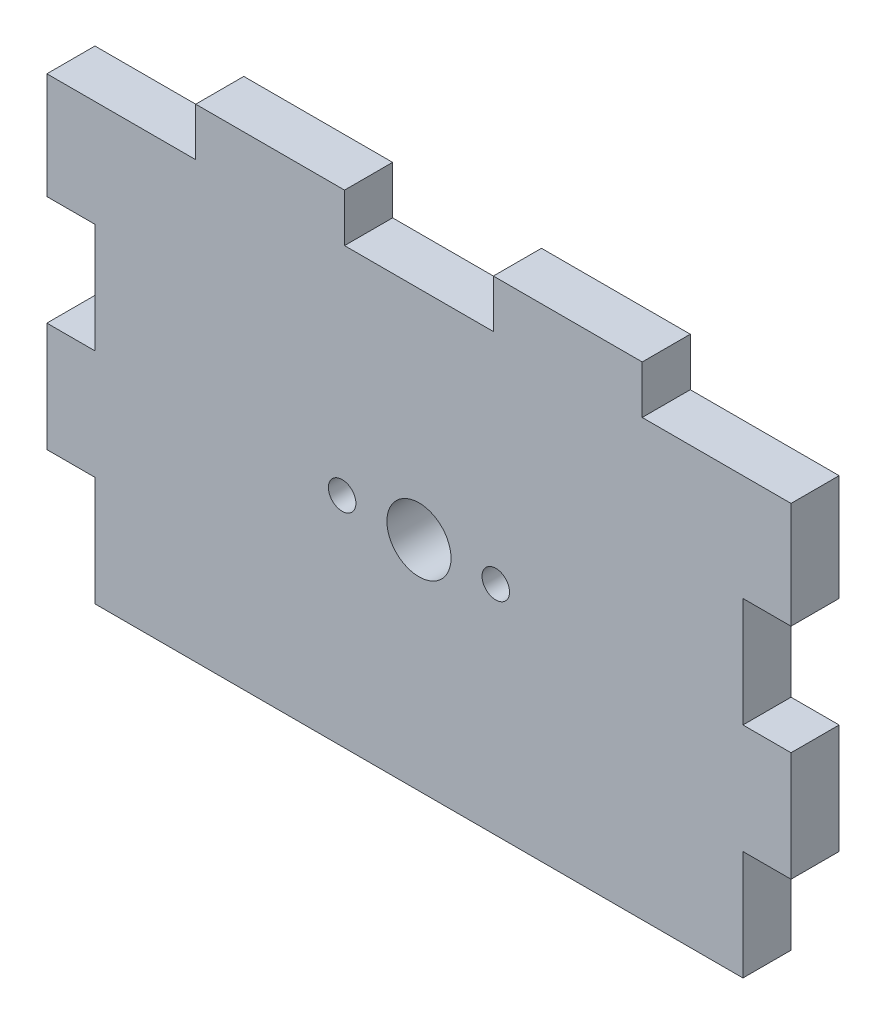
ISO-10303-21;
HEADER;
FILE_DESCRIPTION(('STEP AP214'),'2;1');
FILE_NAME('part.step','',(''),(''),'','','');
FILE_SCHEMA(('AUTOMOTIVE_DESIGN { 1 0 10303 214 1 1 1 1 }'));
ENDSEC;
DATA;
#1=APPLICATION_CONTEXT('core data for automotive mechanical design processes');
#2=APPLICATION_PROTOCOL_DEFINITION('international standard','automotive_design',2000,#1);
#3=PRODUCT_CONTEXT('',#1,'mechanical');
#4=PRODUCT('Part','Part','',(#3));
#5=PRODUCT_RELATED_PRODUCT_CATEGORY('part','',(#4));
#6=PRODUCT_DEFINITION_FORMATION('','',#4);
#7=PRODUCT_DEFINITION_CONTEXT('part definition',#1,'design');
#8=PRODUCT_DEFINITION('design','',#6,#7);
#9=PRODUCT_DEFINITION_SHAPE('','',#8);
#10=(LENGTH_UNIT() NAMED_UNIT(*) SI_UNIT(.MILLI.,.METRE.));
#11=(NAMED_UNIT(*) PLANE_ANGLE_UNIT() SI_UNIT($,.RADIAN.));
#12=(NAMED_UNIT(*) SI_UNIT($,.STERADIAN.) SOLID_ANGLE_UNIT());
#13=UNCERTAINTY_MEASURE_WITH_UNIT(LENGTH_MEASURE(1.E-05),#10,'distance_accuracy_value','');
#14=(GEOMETRIC_REPRESENTATION_CONTEXT(3) GLOBAL_UNCERTAINTY_ASSIGNED_CONTEXT((#13)) GLOBAL_UNIT_ASSIGNED_CONTEXT((#10,
#11,#12)) REPRESENTATION_CONTEXT('',''));
#15=CARTESIAN_POINT('',(0.,0.,0.));
#16=DIRECTION('',(0.,0.,1.));
#17=DIRECTION('',(1.,0.,0.));
#18=AXIS2_PLACEMENT_3D('',#15,#16,#17);
#19=CARTESIAN_POINT('',(-5.53524932452526,14.1108572179902,5.334));
#20=DIRECTION('',(-1.,0.,0.));
#21=DIRECTION('',(0.,0.,1.));
#22=AXIS2_PLACEMENT_3D('',#19,#20,#21);
#23=PLANE('',#22);
#24=DIRECTION('',(0.,1.,0.));
#25=VECTOR('',#24,1.);
#26=CARTESIAN_POINT('',(-5.53524932452526,14.1108572179902,5.334));
#27=LINE('',#26,#25);
#28=CARTESIAN_POINT('',(-5.53524932452527,-3.02097466689072,5.334));
#29=VERTEX_POINT('',#28);
#30=CARTESIAN_POINT('',(-5.53524932452526,8.77685721799016,5.334));
#31=VERTEX_POINT('',#30);
#32=EDGE_CURVE('E369',#29,#31,#27,.T.);
#33=ORIENTED_EDGE('',*,*,#32,.F.);
#34=DIRECTION('',(0.,0.,1.));
#35=VECTOR('',#34,1.);
#36=CARTESIAN_POINT('',(-5.53524932452527,-3.02097466689072,0.));
#37=LINE('',#36,#35);
#38=CARTESIAN_POINT('',(-5.53524932452527,-3.02097466689072,0.));
#39=VERTEX_POINT('',#38);
#40=EDGE_CURVE('E230',#39,#29,#37,.T.);
#41=ORIENTED_EDGE('',*,*,#40,.F.);
#42=DIRECTION('',(0.,1.,0.));
#43=VECTOR('',#42,1.);
#44=CARTESIAN_POINT('',(-5.53524932452526,14.1108572179902,0.));
#45=LINE('',#44,#43);
#46=CARTESIAN_POINT('',(-5.53524932452526,8.77685721799016,0.));
#47=VERTEX_POINT('',#46);
#48=EDGE_CURVE('E217',#39,#47,#45,.T.);
#49=ORIENTED_EDGE('',*,*,#48,.T.);
#50=DIRECTION('',(0.,0.,1.));
#51=VECTOR('',#50,1.);
#52=CARTESIAN_POINT('',(-5.53524932452526,8.77685721799016,0.));
#53=LINE('',#52,#51);
#54=EDGE_CURVE('E312',#47,#31,#53,.T.);
#55=ORIENTED_EDGE('',*,*,#54,.T.);
#56=EDGE_LOOP('',(#33,#41,#49,#55));
#57=FACE_BOUND('',#56,.T.);
#58=ADVANCED_FACE('F35',(#57),#23,.F.);
#59=CARTESIAN_POINT('',(-88.0852493245253,14.1108572179902,5.334));
#60=DIRECTION('',(1.,0.,0.));
#61=DIRECTION('',(0.,0.,-1.));
#62=AXIS2_PLACEMENT_3D('',#59,#60,#61);
#63=PLANE('',#62);
#64=DIRECTION('',(0.,-1.,0.));
#65=VECTOR('',#64,1.);
#66=CARTESIAN_POINT('',(-88.0852493245253,14.1108572179902,0.));
#67=LINE('',#66,#65);
#68=CARTESIAN_POINT('',(-88.0852493245253,8.77685721799016,0.));
#69=VERTEX_POINT('',#68);
#70=CARTESIAN_POINT('',(-88.0852493245253,-3.02097466689073,0.));
#71=VERTEX_POINT('',#70);
#72=EDGE_CURVE('E373',#69,#71,#67,.T.);
#73=ORIENTED_EDGE('',*,*,#72,.T.);
#74=DIRECTION('',(0.,0.,1.));
#75=VECTOR('',#74,1.);
#76=CARTESIAN_POINT('',(-88.0852493245253,-3.02097466689073,0.));
#77=LINE('',#76,#75);
#78=CARTESIAN_POINT('',(-88.0852493245253,-3.02097466689073,5.334));
#79=VERTEX_POINT('',#78);
#80=EDGE_CURVE('E270',#71,#79,#77,.T.);
#81=ORIENTED_EDGE('',*,*,#80,.T.);
#82=DIRECTION('',(0.,-1.,0.));
#83=VECTOR('',#82,1.);
#84=CARTESIAN_POINT('',(-88.0852493245253,14.1108572179902,5.334));
#85=LINE('',#84,#83);
#86=CARTESIAN_POINT('',(-88.0852493245253,8.77685721799016,5.334));
#87=VERTEX_POINT('',#86);
#88=EDGE_CURVE('E362',#87,#79,#85,.T.);
#89=ORIENTED_EDGE('',*,*,#88,.F.);
#90=DIRECTION('',(0.,0.,1.));
#91=VECTOR('',#90,1.);
#92=CARTESIAN_POINT('',(-88.0852493245253,8.77685721799016,0.));
#93=LINE('',#92,#91);
#94=EDGE_CURVE('E350',#69,#87,#93,.T.);
#95=ORIENTED_EDGE('',*,*,#94,.F.);
#96=EDGE_LOOP('',(#73,#81,#89,#95));
#97=FACE_BOUND('',#96,.T.);
#98=ADVANCED_FACE('F429',(#97),#63,.F.);
#99=CARTESIAN_POINT('',(-88.0852493245253,14.1108572179902,5.334));
#100=DIRECTION('',(0.,-1.,0.));
#101=DIRECTION('',(0.,0.,-1.));
#102=AXIS2_PLACEMENT_3D('',#99,#100,#101);
#103=PLANE('',#102);
#104=DIRECTION('',(-1.,0.,0.));
#105=VECTOR('',#104,1.);
#106=CARTESIAN_POINT('',(-88.0852493245253,14.1108572179902,5.334));
#107=LINE('',#106,#105);
#108=CARTESIAN_POINT('',(-55.0652493245253,14.1108572179902,5.334));
#109=VERTEX_POINT('',#108);
#110=CARTESIAN_POINT('',(-71.5752493245253,14.1108572179902,5.334));
#111=VERTEX_POINT('',#110);
#112=EDGE_CURVE('E44',#109,#111,#107,.T.);
#113=ORIENTED_EDGE('',*,*,#112,.F.);
#114=DIRECTION('',(0.,0.,1.));
#115=VECTOR('',#114,1.);
#116=CARTESIAN_POINT('',(-55.0652493245253,14.1108572179902,0.));
#117=LINE('',#116,#115);
#118=CARTESIAN_POINT('',(-55.0652493245253,14.1108572179902,0.));
#119=VERTEX_POINT('',#118);
#120=EDGE_CURVE('E334',#119,#109,#117,.T.);
#121=ORIENTED_EDGE('',*,*,#120,.F.);
#122=DIRECTION('',(-1.,0.,0.));
#123=VECTOR('',#122,1.);
#124=CARTESIAN_POINT('',(-88.0852493245253,14.1108572179902,0.));
#125=LINE('',#124,#123);
#126=CARTESIAN_POINT('',(-71.5752493245253,14.1108572179902,0.));
#127=VERTEX_POINT('',#126);
#128=EDGE_CURVE('E380',#119,#127,#125,.T.);
#129=ORIENTED_EDGE('',*,*,#128,.T.);
#130=DIRECTION('',(0.,0.,1.));
#131=VECTOR('',#130,1.);
#132=CARTESIAN_POINT('',(-71.5752493245253,14.1108572179902,0.));
#133=LINE('',#132,#131);
#134=EDGE_CURVE('E355',#127,#111,#133,.T.);
#135=ORIENTED_EDGE('',*,*,#134,.T.);
#136=EDGE_LOOP('',(#113,#121,#129,#135));
#137=FACE_BOUND('',#136,.T.);
#138=ADVANCED_FACE('F416',(#137),#103,.F.);
#139=CARTESIAN_POINT('',(-88.0852493245253,-15.1750307052638,5.334));
#140=VERTEX_POINT('',#139);
#141=CARTESIAN_POINT('',(-88.0852493245253,-27.3290867436368,5.334));
#142=VERTEX_POINT('',#141);
#143=EDGE_CURVE('E366',#140,#142,#85,.T.);
#144=ORIENTED_EDGE('',*,*,#143,.F.);
#145=DIRECTION('',(0.,0.,1.));
#146=VECTOR('',#145,1.);
#147=CARTESIAN_POINT('',(-88.0852493245253,-15.1750307052638,0.));
#148=LINE('',#147,#146);
#149=CARTESIAN_POINT('',(-88.0852493245253,-15.1750307052638,0.));
#150=VERTEX_POINT('',#149);
#151=EDGE_CURVE('E263',#150,#140,#148,.T.);
#152=ORIENTED_EDGE('',*,*,#151,.F.);
#153=CARTESIAN_POINT('',(-88.0852493245253,-27.3290867436368,0.));
#154=VERTEX_POINT('',#153);
#155=EDGE_CURVE('E358',#150,#154,#67,.T.);
#156=ORIENTED_EDGE('',*,*,#155,.T.);
#157=DIRECTION('',(0.,0.,1.));
#158=VECTOR('',#157,1.);
#159=CARTESIAN_POINT('',(-88.0852493245253,-27.3290867436368,0.));
#160=LINE('',#159,#158);
#161=EDGE_CURVE('E291',#154,#142,#160,.T.);
#162=ORIENTED_EDGE('',*,*,#161,.T.);
#163=EDGE_LOOP('',(#144,#152,#156,#162));
#164=FACE_BOUND('',#163,.T.);
#165=ADVANCED_FACE('F37',(#164),#63,.F.);
#166=CARTESIAN_POINT('',(-88.0852493245253,-39.4831427820098,5.334));
#167=DIRECTION('',(0.,1.,0.));
#168=DIRECTION('',(0.,0.,1.));
#169=AXIS2_PLACEMENT_3D('',#166,#167,#168);
#170=PLANE('',#169);
#171=DIRECTION('',(1.,0.,0.));
#172=VECTOR('',#171,1.);
#173=CARTESIAN_POINT('',(-88.0852493245253,-39.4831427820098,0.));
#174=LINE('',#173,#172);
#175=CARTESIAN_POINT('',(-82.7512493245253,-39.4831427820098,0.));
#176=VERTEX_POINT('',#175);
#177=CARTESIAN_POINT('',(-10.8692493245253,-39.4831427820098,0.));
#178=VERTEX_POINT('',#177);
#179=EDGE_CURVE('E376',#176,#178,#174,.T.);
#180=ORIENTED_EDGE('',*,*,#179,.T.);
#181=DIRECTION('',(0.,0.,1.));
#182=VECTOR('',#181,1.);
#183=CARTESIAN_POINT('',(-10.8692493245253,-39.4831427820098,0.));
#184=LINE('',#183,#182);
#185=CARTESIAN_POINT('',(-10.8692493245253,-39.4831427820098,5.334));
#186=VERTEX_POINT('',#185);
#187=EDGE_CURVE('E246',#178,#186,#184,.T.);
#188=ORIENTED_EDGE('',*,*,#187,.T.);
#189=DIRECTION('',(1.,0.,0.));
#190=VECTOR('',#189,1.);
#191=CARTESIAN_POINT('',(-88.0852493245253,-39.4831427820098,5.334));
#192=LINE('',#191,#190);
#193=CARTESIAN_POINT('',(-82.7512493245253,-39.4831427820098,5.334));
#194=VERTEX_POINT('',#193);
#195=EDGE_CURVE('E365',#194,#186,#192,.T.);
#196=ORIENTED_EDGE('',*,*,#195,.F.);
#197=DIRECTION('',(0.,0.,1.));
#198=VECTOR('',#197,1.);
#199=CARTESIAN_POINT('',(-82.7512493245253,-39.4831427820098,0.));
#200=LINE('',#199,#198);
#201=EDGE_CURVE('E286',#176,#194,#200,.T.);
#202=ORIENTED_EDGE('',*,*,#201,.F.);
#203=EDGE_LOOP('',(#180,#188,#196,#202));
#204=FACE_BOUND('',#203,.T.);
#205=ADVANCED_FACE('F457',(#204),#170,.F.);
#206=CARTESIAN_POINT('',(-5.53524932452526,-27.3290867436368,0.));
#207=VERTEX_POINT('',#206);
#208=CARTESIAN_POINT('',(-5.53524932452527,-15.1750307052638,0.));
#209=VERTEX_POINT('',#208);
#210=EDGE_CURVE('E378',#207,#209,#45,.T.);
#211=ORIENTED_EDGE('',*,*,#210,.T.);
#212=DIRECTION('',(0.,0.,1.));
#213=VECTOR('',#212,1.);
#214=CARTESIAN_POINT('',(-5.53524932452527,-15.1750307052638,0.));
#215=LINE('',#214,#213);
#216=CARTESIAN_POINT('',(-5.53524932452527,-15.1750307052638,5.334));
#217=VERTEX_POINT('',#216);
#218=EDGE_CURVE('E233',#209,#217,#215,.T.);
#219=ORIENTED_EDGE('',*,*,#218,.T.);
#220=CARTESIAN_POINT('',(-5.53524932452526,-27.3290867436368,5.334));
#221=VERTEX_POINT('',#220);
#222=EDGE_CURVE('E370',#221,#217,#27,.T.);
#223=ORIENTED_EDGE('',*,*,#222,.F.);
#224=DIRECTION('',(0.,0.,1.));
#225=VECTOR('',#224,1.);
#226=CARTESIAN_POINT('',(-5.53524932452526,-27.3290867436368,0.));
#227=LINE('',#226,#225);
#228=EDGE_CURVE('E242',#207,#221,#227,.T.);
#229=ORIENTED_EDGE('',*,*,#228,.F.);
#230=EDGE_LOOP('',(#211,#219,#223,#229));
#231=FACE_BOUND('',#230,.T.);
#232=ADVANCED_FACE('F464',(#231),#23,.F.);
#233=CARTESIAN_POINT('',(-22.0452493245253,14.1108572179902,5.334));
#234=VERTEX_POINT('',#233);
#235=CARTESIAN_POINT('',(-38.5552493245253,14.1108572179902,5.334));
#236=VERTEX_POINT('',#235);
#237=EDGE_CURVE('E11',#234,#236,#107,.T.);
#238=ORIENTED_EDGE('',*,*,#237,.F.);
#239=DIRECTION('',(0.,0.,1.));
#240=VECTOR('',#239,1.);
#241=CARTESIAN_POINT('',(-22.0452493245253,14.1108572179902,0.));
#242=LINE('',#241,#240);
#243=CARTESIAN_POINT('',(-22.0452493245253,14.1108572179902,0.));
#244=VERTEX_POINT('',#243);
#245=EDGE_CURVE('E309',#244,#234,#242,.T.);
#246=ORIENTED_EDGE('',*,*,#245,.F.);
#247=CARTESIAN_POINT('',(-38.5552493245253,14.1108572179902,0.));
#248=VERTEX_POINT('',#247);
#249=EDGE_CURVE('E39',#244,#248,#125,.T.);
#250=ORIENTED_EDGE('',*,*,#249,.T.);
#251=DIRECTION('',(0.,0.,1.));
#252=VECTOR('',#251,1.);
#253=CARTESIAN_POINT('',(-38.5552493245253,14.1108572179902,0.));
#254=LINE('',#253,#252);
#255=EDGE_CURVE('E337',#248,#236,#254,.T.);
#256=ORIENTED_EDGE('',*,*,#255,.T.);
#257=EDGE_LOOP('',(#238,#246,#250,#256));
#258=FACE_BOUND('',#257,.T.);
#259=ADVANCED_FACE('F398',(#258),#103,.F.);
#260=CARTESIAN_POINT('',(0.,0.,5.334));
#261=DIRECTION('',(0.,0.,1.));
#262=DIRECTION('',(1.,0.,0.));
#263=AXIS2_PLACEMENT_3D('',#260,#261,#262);
#264=PLANE('',#263);
#265=CARTESIAN_POINT('',(-38.2885493245253,-15.3531427820098,5.334));
#266=DIRECTION('',(0.,0.,1.));
#267=DIRECTION('',(-1.,0.,0.));
#268=AXIS2_PLACEMENT_3D('',#265,#266,#267);
#269=CIRCLE('',#268,1.524);
#270=CARTESIAN_POINT('',(-39.8125493245253,-15.3531427820098,5.334));
#271=VERTEX_POINT('',#270);
#272=EDGE_CURVE('E605',#271,#271,#269,.T.);
#273=ORIENTED_EDGE('',*,*,#272,.F.);
#274=EDGE_LOOP('',(#273));
#275=FACE_BOUND('',#274,.T.);
#276=CARTESIAN_POINT('',(-55.3319493245253,-15.3531427820098,5.334));
#277=DIRECTION('',(0.,0.,1.));
#278=DIRECTION('',(1.,0.,0.));
#279=AXIS2_PLACEMENT_3D('',#276,#277,#278);
#280=CIRCLE('',#279,1.524);
#281=CARTESIAN_POINT('',(-53.8079493245253,-15.3531427820098,5.334));
#282=VERTEX_POINT('',#281);
#283=EDGE_CURVE('E607',#282,#282,#280,.T.);
#284=ORIENTED_EDGE('',*,*,#283,.F.);
#285=EDGE_LOOP('',(#284));
#286=FACE_BOUND('',#285,.T.);
#287=CARTESIAN_POINT('',(-46.8102493245253,-15.3531427820098,5.334));
#288=DIRECTION('',(0.,0.,1.));
#289=DIRECTION('',(1.,0.,0.));
#290=AXIS2_PLACEMENT_3D('',#287,#288,#289);
#291=CIRCLE('',#290,3.55600000000001);
#292=CARTESIAN_POINT('',(-43.2542493245252,-15.3531427820098,5.334));
#293=VERTEX_POINT('',#292);
#294=EDGE_CURVE('E223',#293,#293,#291,.T.);
#295=ORIENTED_EDGE('',*,*,#294,.F.);
#296=EDGE_LOOP('',(#295));
#297=FACE_BOUND('',#296,.T.);
#298=DIRECTION('',(-1.,0.,0.));
#299=VECTOR('',#298,1.);
#300=CARTESIAN_POINT('',(-5.53524932452527,-3.02097466689072,5.334));
#301=LINE('',#300,#299);
#302=CARTESIAN_POINT('',(-10.8692493245253,-3.02097466689072,5.334));
#303=VERTEX_POINT('',#302);
#304=EDGE_CURVE('E203',#29,#303,#301,.T.);
#305=ORIENTED_EDGE('',*,*,#304,.F.);
#306=ORIENTED_EDGE('',*,*,#32,.T.);
#307=DIRECTION('',(1.,0.,0.));
#308=VECTOR('',#307,1.);
#309=CARTESIAN_POINT('',(-22.0452493245253,8.77685721799016,5.334));
#310=LINE('',#309,#308);
#311=CARTESIAN_POINT('',(-22.0452493245253,8.77685721799016,5.334));
#312=VERTEX_POINT('',#311);
#313=EDGE_CURVE('E302',#312,#31,#310,.T.);
#314=ORIENTED_EDGE('',*,*,#313,.F.);
#315=DIRECTION('',(0.,-1.,0.));
#316=VECTOR('',#315,1.);
#317=CARTESIAN_POINT('',(-22.0452493245253,14.1108572179902,5.334));
#318=LINE('',#317,#316);
#319=EDGE_CURVE('E294',#234,#312,#318,.T.);
#320=ORIENTED_EDGE('',*,*,#319,.F.);
#321=ORIENTED_EDGE('',*,*,#237,.T.);
#322=DIRECTION('',(0.,1.,0.));
#323=VECTOR('',#322,1.);
#324=CARTESIAN_POINT('',(-38.5552493245253,14.1108572179902,5.334));
#325=LINE('',#324,#323);
#326=CARTESIAN_POINT('',(-38.5552493245253,8.77685721799016,5.334));
#327=VERTEX_POINT('',#326);
#328=EDGE_CURVE('E320',#327,#236,#325,.T.);
#329=ORIENTED_EDGE('',*,*,#328,.F.);
#330=DIRECTION('',(1.,0.,0.));
#331=VECTOR('',#330,1.);
#332=CARTESIAN_POINT('',(-55.0652493245253,8.77685721799016,5.334));
#333=LINE('',#332,#331);
#334=CARTESIAN_POINT('',(-55.0652493245253,8.77685721799016,5.334));
#335=VERTEX_POINT('',#334);
#336=EDGE_CURVE('E329',#335,#327,#333,.T.);
#337=ORIENTED_EDGE('',*,*,#336,.F.);
#338=DIRECTION('',(0.,-1.,0.));
#339=VECTOR('',#338,1.);
#340=CARTESIAN_POINT('',(-55.0652493245253,14.1108572179902,5.334));
#341=LINE('',#340,#339);
#342=EDGE_CURVE('E311',#109,#335,#341,.T.);
#343=ORIENTED_EDGE('',*,*,#342,.F.);
#344=ORIENTED_EDGE('',*,*,#112,.T.);
#345=DIRECTION('',(0.,1.,0.));
#346=VECTOR('',#345,1.);
#347=CARTESIAN_POINT('',(-71.5752493245253,14.1108572179902,5.334));
#348=LINE('',#347,#346);
#349=CARTESIAN_POINT('',(-71.5752493245253,8.77685721799016,5.334));
#350=VERTEX_POINT('',#349);
#351=EDGE_CURVE('E347',#350,#111,#348,.T.);
#352=ORIENTED_EDGE('',*,*,#351,.F.);
#353=DIRECTION('',(1.,0.,0.));
#354=VECTOR('',#353,1.);
#355=CARTESIAN_POINT('',(-88.0852493245253,8.77685721799016,5.334));
#356=LINE('',#355,#354);
#357=EDGE_CURVE('E336',#87,#350,#356,.T.);
#358=ORIENTED_EDGE('',*,*,#357,.F.);
#359=ORIENTED_EDGE('',*,*,#88,.T.);
#360=DIRECTION('',(-1.,0.,0.));
#361=VECTOR('',#360,1.);
#362=CARTESIAN_POINT('',(-88.0852493245253,-3.02097466689073,5.334));
#363=LINE('',#362,#361);
#364=CARTESIAN_POINT('',(-82.7512493245253,-3.02097466689073,5.334));
#365=VERTEX_POINT('',#364);
#366=EDGE_CURVE('E257',#365,#79,#363,.T.);
#367=ORIENTED_EDGE('',*,*,#366,.F.);
#368=DIRECTION('',(0.,1.,0.));
#369=VECTOR('',#368,1.);
#370=CARTESIAN_POINT('',(-82.7512493245253,-3.02097466689073,5.334));
#371=LINE('',#370,#369);
#372=CARTESIAN_POINT('',(-82.7512493245253,-15.1750307052638,5.334));
#373=VERTEX_POINT('',#372);
#374=EDGE_CURVE('E266',#373,#365,#371,.T.);
#375=ORIENTED_EDGE('',*,*,#374,.F.);
#376=DIRECTION('',(1.,0.,0.));
#377=VECTOR('',#376,1.);
#378=CARTESIAN_POINT('',(-88.0852493245253,-15.1750307052638,5.334));
#379=LINE('',#378,#377);
#380=EDGE_CURVE('E249',#140,#373,#379,.T.);
#381=ORIENTED_EDGE('',*,*,#380,.F.);
#382=ORIENTED_EDGE('',*,*,#143,.T.);
#383=DIRECTION('',(-1.,0.,0.));
#384=VECTOR('',#383,1.);
#385=CARTESIAN_POINT('',(-88.0852493245253,-27.3290867436368,5.334));
#386=LINE('',#385,#384);
#387=CARTESIAN_POINT('',(-82.7512493245253,-27.3290867436368,5.334));
#388=VERTEX_POINT('',#387);
#389=EDGE_CURVE('E283',#388,#142,#386,.T.);
#390=ORIENTED_EDGE('',*,*,#389,.F.);
#391=DIRECTION('',(0.,1.,0.));
#392=VECTOR('',#391,1.);
#393=CARTESIAN_POINT('',(-82.7512493245253,-39.4831427820098,5.334));
#394=LINE('',#393,#392);
#395=EDGE_CURVE('E273',#194,#388,#394,.T.);
#396=ORIENTED_EDGE('',*,*,#395,.F.);
#397=ORIENTED_EDGE('',*,*,#195,.T.);
#398=DIRECTION('',(0.,-1.,0.));
#399=VECTOR('',#398,1.);
#400=CARTESIAN_POINT('',(-10.8692493245253,-39.4831427820098,5.334));
#401=LINE('',#400,#399);
#402=CARTESIAN_POINT('',(-10.8692493245253,-27.3290867436368,5.334));
#403=VERTEX_POINT('',#402);
#404=EDGE_CURVE('E240',#403,#186,#401,.T.);
#405=ORIENTED_EDGE('',*,*,#404,.F.);
#406=DIRECTION('',(-1.,0.,0.));
#407=VECTOR('',#406,1.);
#408=CARTESIAN_POINT('',(-5.53524932452526,-27.3290867436368,5.334));
#409=LINE('',#408,#407);
#410=EDGE_CURVE('E232',#221,#403,#409,.T.);
#411=ORIENTED_EDGE('',*,*,#410,.F.);
#412=ORIENTED_EDGE('',*,*,#222,.T.);
#413=DIRECTION('',(1.,0.,0.));
#414=VECTOR('',#413,1.);
#415=CARTESIAN_POINT('',(-5.53524932452527,-15.1750307052638,5.334));
#416=LINE('',#415,#414);
#417=CARTESIAN_POINT('',(-10.8692493245253,-15.1750307052638,5.334));
#418=VERTEX_POINT('',#417);
#419=EDGE_CURVE('E218',#418,#217,#416,.T.);
#420=ORIENTED_EDGE('',*,*,#419,.F.);
#421=DIRECTION('',(0.,-1.,0.));
#422=VECTOR('',#421,1.);
#423=CARTESIAN_POINT('',(-10.8692493245253,-3.02097466689072,5.334));
#424=LINE('',#423,#422);
#425=EDGE_CURVE('E220',#303,#418,#424,.T.);
#426=ORIENTED_EDGE('',*,*,#425,.F.);
#427=EDGE_LOOP('',(#305,#306,#314,#320,#321,#329,#337,#343,#344,#352,#358,#359,#367,#375,#381,
#382,#390,#396,#397,#405,#411,#412,#420,#426));
#428=FACE_BOUND('',#427,.T.);
#429=ADVANCED_FACE('F402',(#275,#286,#297,#428),#264,.T.);
#430=CARTESIAN_POINT('',(0.,0.,0.));
#431=DIRECTION('',(0.,0.,1.));
#432=DIRECTION('',(1.,0.,0.));
#433=AXIS2_PLACEMENT_3D('',#430,#431,#432);
#434=PLANE('',#433);
#435=CARTESIAN_POINT('',(-38.2885493245253,-15.3531427820098,0.));
#436=DIRECTION('',(0.,0.,1.));
#437=DIRECTION('',(-1.,0.,0.));
#438=AXIS2_PLACEMENT_3D('',#435,#436,#437);
#439=CIRCLE('',#438,1.524);
#440=CARTESIAN_POINT('',(-39.8125493245253,-15.3531427820098,0.));
#441=VERTEX_POINT('',#440);
#442=EDGE_CURVE('E602',#441,#441,#439,.T.);
#443=ORIENTED_EDGE('',*,*,#442,.T.);
#444=EDGE_LOOP('',(#443));
#445=FACE_BOUND('',#444,.T.);
#446=CARTESIAN_POINT('',(-55.3319493245253,-15.3531427820098,0.));
#447=DIRECTION('',(0.,0.,1.));
#448=DIRECTION('',(1.,0.,0.));
#449=AXIS2_PLACEMENT_3D('',#446,#447,#448);
#450=CIRCLE('',#449,1.524);
#451=CARTESIAN_POINT('',(-53.8079493245253,-15.3531427820098,0.));
#452=VERTEX_POINT('',#451);
#453=EDGE_CURVE('E610',#452,#452,#450,.T.);
#454=ORIENTED_EDGE('',*,*,#453,.T.);
#455=EDGE_LOOP('',(#454));
#456=FACE_BOUND('',#455,.T.);
#457=CARTESIAN_POINT('',(-46.8102493245253,-15.3531427820098,0.));
#458=DIRECTION('',(0.,0.,1.));
#459=DIRECTION('',(1.,0.,0.));
#460=AXIS2_PLACEMENT_3D('',#457,#458,#459);
#461=CIRCLE('',#460,3.55600000000001);
#462=CARTESIAN_POINT('',(-43.2542493245252,-15.3531427820098,0.));
#463=VERTEX_POINT('',#462);
#464=EDGE_CURVE('E228',#463,#463,#461,.T.);
#465=ORIENTED_EDGE('',*,*,#464,.T.);
#466=EDGE_LOOP('',(#465));
#467=FACE_BOUND('',#466,.T.);
#468=ORIENTED_EDGE('',*,*,#48,.F.);
#469=DIRECTION('',(-1.,0.,0.));
#470=VECTOR('',#469,1.);
#471=CARTESIAN_POINT('',(-5.53524932452527,-3.02097466689072,0.));
#472=LINE('',#471,#470);
#473=CARTESIAN_POINT('',(-10.8692493245253,-3.02097466689072,0.));
#474=VERTEX_POINT('',#473);
#475=EDGE_CURVE('E200',#39,#474,#472,.T.);
#476=ORIENTED_EDGE('',*,*,#475,.T.);
#477=DIRECTION('',(0.,-1.,0.));
#478=VECTOR('',#477,1.);
#479=CARTESIAN_POINT('',(-10.8692493245253,-3.02097466689072,0.));
#480=LINE('',#479,#478);
#481=CARTESIAN_POINT('',(-10.8692493245253,-15.1750307052638,0.));
#482=VERTEX_POINT('',#481);
#483=EDGE_CURVE('E210',#474,#482,#480,.T.);
#484=ORIENTED_EDGE('',*,*,#483,.T.);
#485=DIRECTION('',(1.,0.,0.));
#486=VECTOR('',#485,1.);
#487=CARTESIAN_POINT('',(-5.53524932452527,-15.1750307052638,0.));
#488=LINE('',#487,#486);
#489=EDGE_CURVE('E52',#482,#209,#488,.T.);
#490=ORIENTED_EDGE('',*,*,#489,.T.);
#491=ORIENTED_EDGE('',*,*,#210,.F.);
#492=DIRECTION('',(-1.,0.,0.));
#493=VECTOR('',#492,1.);
#494=CARTESIAN_POINT('',(-5.53524932452526,-27.3290867436368,0.));
#495=LINE('',#494,#493);
#496=CARTESIAN_POINT('',(-10.8692493245253,-27.3290867436368,0.));
#497=VERTEX_POINT('',#496);
#498=EDGE_CURVE('E237',#207,#497,#495,.T.);
#499=ORIENTED_EDGE('',*,*,#498,.T.);
#500=DIRECTION('',(0.,-1.,0.));
#501=VECTOR('',#500,1.);
#502=CARTESIAN_POINT('',(-10.8692493245253,-39.4831427820098,0.));
#503=LINE('',#502,#501);
#504=EDGE_CURVE('E60',#497,#178,#503,.T.);
#505=ORIENTED_EDGE('',*,*,#504,.T.);
#506=ORIENTED_EDGE('',*,*,#179,.F.);
#507=DIRECTION('',(0.,1.,0.));
#508=VECTOR('',#507,1.);
#509=CARTESIAN_POINT('',(-82.7512493245253,-39.4831427820098,0.));
#510=LINE('',#509,#508);
#511=CARTESIAN_POINT('',(-82.7512493245253,-27.3290867436368,0.));
#512=VERTEX_POINT('',#511);
#513=EDGE_CURVE('E279',#176,#512,#510,.T.);
#514=ORIENTED_EDGE('',*,*,#513,.T.);
#515=DIRECTION('',(-1.,0.,0.));
#516=VECTOR('',#515,1.);
#517=CARTESIAN_POINT('',(-88.0852493245253,-27.3290867436368,0.));
#518=LINE('',#517,#516);
#519=EDGE_CURVE('E282',#512,#154,#518,.T.);
#520=ORIENTED_EDGE('',*,*,#519,.T.);
#521=ORIENTED_EDGE('',*,*,#155,.F.);
#522=DIRECTION('',(1.,0.,0.));
#523=VECTOR('',#522,1.);
#524=CARTESIAN_POINT('',(-88.0852493245253,-15.1750307052638,0.));
#525=LINE('',#524,#523);
#526=CARTESIAN_POINT('',(-82.7512493245253,-15.1750307052638,0.));
#527=VERTEX_POINT('',#526);
#528=EDGE_CURVE('E253',#150,#527,#525,.T.);
#529=ORIENTED_EDGE('',*,*,#528,.T.);
#530=DIRECTION('',(0.,1.,0.));
#531=VECTOR('',#530,1.);
#532=CARTESIAN_POINT('',(-82.7512493245253,-3.02097466689073,0.));
#533=LINE('',#532,#531);
#534=CARTESIAN_POINT('',(-82.7512493245253,-3.02097466689073,0.));
#535=VERTEX_POINT('',#534);
#536=EDGE_CURVE('E256',#527,#535,#533,.T.);
#537=ORIENTED_EDGE('',*,*,#536,.T.);
#538=DIRECTION('',(-1.,0.,0.));
#539=VECTOR('',#538,1.);
#540=CARTESIAN_POINT('',(-88.0852493245253,-3.02097466689073,0.));
#541=LINE('',#540,#539);
#542=EDGE_CURVE('E260',#535,#71,#541,.T.);
#543=ORIENTED_EDGE('',*,*,#542,.T.);
#544=ORIENTED_EDGE('',*,*,#72,.F.);
#545=DIRECTION('',(1.,0.,0.));
#546=VECTOR('',#545,1.);
#547=CARTESIAN_POINT('',(-88.0852493245253,8.77685721799016,0.));
#548=LINE('',#547,#546);
#549=CARTESIAN_POINT('',(-71.5752493245253,8.77685721799016,0.));
#550=VERTEX_POINT('',#549);
#551=EDGE_CURVE('E343',#69,#550,#548,.T.);
#552=ORIENTED_EDGE('',*,*,#551,.T.);
#553=DIRECTION('',(0.,1.,0.));
#554=VECTOR('',#553,1.);
#555=CARTESIAN_POINT('',(-71.5752493245253,14.1108572179902,0.));
#556=LINE('',#555,#554);
#557=EDGE_CURVE('E346',#550,#127,#556,.T.);
#558=ORIENTED_EDGE('',*,*,#557,.T.);
#559=ORIENTED_EDGE('',*,*,#128,.F.);
#560=DIRECTION('',(0.,-1.,0.));
#561=VECTOR('',#560,1.);
#562=CARTESIAN_POINT('',(-55.0652493245253,14.1108572179902,0.));
#563=LINE('',#562,#561);
#564=CARTESIAN_POINT('',(-55.0652493245253,8.77685721799016,0.));
#565=VERTEX_POINT('',#564);
#566=EDGE_CURVE('E316',#119,#565,#563,.T.);
#567=ORIENTED_EDGE('',*,*,#566,.T.);
#568=DIRECTION('',(1.,0.,0.));
#569=VECTOR('',#568,1.);
#570=CARTESIAN_POINT('',(-55.0652493245253,8.77685721799016,0.));
#571=LINE('',#570,#569);
#572=CARTESIAN_POINT('',(-38.5552493245253,8.77685721799016,0.));
#573=VERTEX_POINT('',#572);
#574=EDGE_CURVE('E319',#565,#573,#571,.T.);
#575=ORIENTED_EDGE('',*,*,#574,.T.);
#576=DIRECTION('',(0.,1.,0.));
#577=VECTOR('',#576,1.);
#578=CARTESIAN_POINT('',(-38.5552493245253,14.1108572179902,0.));
#579=LINE('',#578,#577);
#580=EDGE_CURVE('E323',#573,#248,#579,.T.);
#581=ORIENTED_EDGE('',*,*,#580,.T.);
#582=ORIENTED_EDGE('',*,*,#249,.F.);
#583=DIRECTION('',(0.,-1.,0.));
#584=VECTOR('',#583,1.);
#585=CARTESIAN_POINT('',(-22.0452493245253,14.1108572179902,0.));
#586=LINE('',#585,#584);
#587=CARTESIAN_POINT('',(-22.0452493245253,8.77685721799016,0.));
#588=VERTEX_POINT('',#587);
#589=EDGE_CURVE('E298',#244,#588,#586,.T.);
#590=ORIENTED_EDGE('',*,*,#589,.T.);
#591=DIRECTION('',(1.,0.,0.));
#592=VECTOR('',#591,1.);
#593=CARTESIAN_POINT('',(-22.0452493245253,8.77685721799016,0.));
#594=LINE('',#593,#592);
#595=EDGE_CURVE('E301',#588,#47,#594,.T.);
#596=ORIENTED_EDGE('',*,*,#595,.T.);
#597=EDGE_LOOP('',(#468,#476,#484,#490,#491,#499,#505,#506,#514,#520,#521,#529,#537,#543,#544,
#552,#558,#559,#567,#575,#581,#582,#590,#596));
#598=FACE_BOUND('',#597,.T.);
#599=ADVANCED_FACE('F215',(#445,#456,#467,#598),#434,.F.);
#600=CARTESIAN_POINT('',(-71.5752493245253,14.1108572179902,0.));
#601=DIRECTION('',(1.,0.,0.));
#602=DIRECTION('',(0.,0.,-1.));
#603=AXIS2_PLACEMENT_3D('',#600,#601,#602);
#604=PLANE('',#603);
#605=ORIENTED_EDGE('',*,*,#351,.T.);
#606=ORIENTED_EDGE('',*,*,#134,.F.);
#607=ORIENTED_EDGE('',*,*,#557,.F.);
#608=DIRECTION('',(0.,0.,1.));
#609=VECTOR('',#608,1.);
#610=CARTESIAN_POINT('',(-71.5752493245253,8.77685721799016,0.));
#611=LINE('',#610,#609);
#612=EDGE_CURVE('E359',#550,#350,#611,.T.);
#613=ORIENTED_EDGE('',*,*,#612,.T.);
#614=EDGE_LOOP('',(#605,#606,#607,#613));
#615=FACE_BOUND('',#614,.T.);
#616=ADVANCED_FACE('F420',(#615),#604,.F.);
#617=CARTESIAN_POINT('',(-88.0852493245253,8.77685721799016,0.));
#618=DIRECTION('',(0.,-1.,0.));
#619=DIRECTION('',(0.,0.,-1.));
#620=AXIS2_PLACEMENT_3D('',#617,#618,#619);
#621=PLANE('',#620);
#622=ORIENTED_EDGE('',*,*,#357,.T.);
#623=ORIENTED_EDGE('',*,*,#612,.F.);
#624=ORIENTED_EDGE('',*,*,#551,.F.);
#625=ORIENTED_EDGE('',*,*,#94,.T.);
#626=EDGE_LOOP('',(#622,#623,#624,#625));
#627=FACE_BOUND('',#626,.T.);
#628=ADVANCED_FACE('F425',(#627),#621,.F.);
#629=CARTESIAN_POINT('',(-55.0652493245253,14.1108572179902,0.));
#630=DIRECTION('',(-1.,0.,0.));
#631=DIRECTION('',(0.,0.,1.));
#632=AXIS2_PLACEMENT_3D('',#629,#630,#631);
#633=PLANE('',#632);
#634=ORIENTED_EDGE('',*,*,#342,.T.);
#635=DIRECTION('',(0.,0.,1.));
#636=VECTOR('',#635,1.);
#637=CARTESIAN_POINT('',(-55.0652493245253,8.77685721799016,0.));
#638=LINE('',#637,#636);
#639=EDGE_CURVE('E326',#565,#335,#638,.T.);
#640=ORIENTED_EDGE('',*,*,#639,.F.);
#641=ORIENTED_EDGE('',*,*,#566,.F.);
#642=ORIENTED_EDGE('',*,*,#120,.T.);
#643=EDGE_LOOP('',(#634,#640,#641,#642));
#644=FACE_BOUND('',#643,.T.);
#645=ADVANCED_FACE('F505',(#644),#633,.F.);
#646=CARTESIAN_POINT('',(-38.5552493245253,14.1108572179902,0.));
#647=DIRECTION('',(1.,0.,0.));
#648=DIRECTION('',(0.,0.,-1.));
#649=AXIS2_PLACEMENT_3D('',#646,#647,#648);
#650=PLANE('',#649);
#651=ORIENTED_EDGE('',*,*,#328,.T.);
#652=ORIENTED_EDGE('',*,*,#255,.F.);
#653=ORIENTED_EDGE('',*,*,#580,.F.);
#654=DIRECTION('',(0.,0.,1.));
#655=VECTOR('',#654,1.);
#656=CARTESIAN_POINT('',(-38.5552493245253,8.77685721799016,0.));
#657=LINE('',#656,#655);
#658=EDGE_CURVE('E340',#573,#327,#657,.T.);
#659=ORIENTED_EDGE('',*,*,#658,.T.);
#660=EDGE_LOOP('',(#651,#652,#653,#659));
#661=FACE_BOUND('',#660,.T.);
#662=ADVANCED_FACE('F405',(#661),#650,.F.);
#663=CARTESIAN_POINT('',(-55.0652493245253,8.77685721799016,0.));
#664=DIRECTION('',(0.,-1.,0.));
#665=DIRECTION('',(0.,0.,-1.));
#666=AXIS2_PLACEMENT_3D('',#663,#664,#665);
#667=PLANE('',#666);
#668=ORIENTED_EDGE('',*,*,#336,.T.);
#669=ORIENTED_EDGE('',*,*,#658,.F.);
#670=ORIENTED_EDGE('',*,*,#574,.F.);
#671=ORIENTED_EDGE('',*,*,#639,.T.);
#672=EDGE_LOOP('',(#668,#669,#670,#671));
#673=FACE_BOUND('',#672,.T.);
#674=ADVANCED_FACE('F409',(#673),#667,.F.);
#675=CARTESIAN_POINT('',(-22.0452493245253,14.1108572179902,0.));
#676=DIRECTION('',(-1.,0.,0.));
#677=DIRECTION('',(0.,0.,1.));
#678=AXIS2_PLACEMENT_3D('',#675,#676,#677);
#679=PLANE('',#678);
#680=ORIENTED_EDGE('',*,*,#319,.T.);
#681=DIRECTION('',(0.,0.,1.));
#682=VECTOR('',#681,1.);
#683=CARTESIAN_POINT('',(-22.0452493245253,8.77685721799016,0.));
#684=LINE('',#683,#682);
#685=EDGE_CURVE('E304',#588,#312,#684,.T.);
#686=ORIENTED_EDGE('',*,*,#685,.F.);
#687=ORIENTED_EDGE('',*,*,#589,.F.);
#688=ORIENTED_EDGE('',*,*,#245,.T.);
#689=EDGE_LOOP('',(#680,#686,#687,#688));
#690=FACE_BOUND('',#689,.T.);
#691=ADVANCED_FACE('F394',(#690),#679,.F.);
#692=CARTESIAN_POINT('',(-22.0452493245253,8.77685721799016,0.));
#693=DIRECTION('',(0.,-1.,0.));
#694=DIRECTION('',(0.,0.,-1.));
#695=AXIS2_PLACEMENT_3D('',#692,#693,#694);
#696=PLANE('',#695);
#697=ORIENTED_EDGE('',*,*,#313,.T.);
#698=ORIENTED_EDGE('',*,*,#54,.F.);
#699=ORIENTED_EDGE('',*,*,#595,.F.);
#700=ORIENTED_EDGE('',*,*,#685,.T.);
#701=EDGE_LOOP('',(#697,#698,#699,#700));
#702=FACE_BOUND('',#701,.T.);
#703=ADVANCED_FACE('F389',(#702),#696,.F.);
#704=CARTESIAN_POINT('',(-88.0852493245253,-27.3290867436368,0.));
#705=DIRECTION('',(0.,1.,0.));
#706=DIRECTION('',(0.,0.,1.));
#707=AXIS2_PLACEMENT_3D('',#704,#705,#706);
#708=PLANE('',#707);
#709=ORIENTED_EDGE('',*,*,#389,.T.);
#710=ORIENTED_EDGE('',*,*,#161,.F.);
#711=ORIENTED_EDGE('',*,*,#519,.F.);
#712=DIRECTION('',(0.,0.,1.));
#713=VECTOR('',#712,1.);
#714=CARTESIAN_POINT('',(-82.7512493245253,-27.3290867436368,0.));
#715=LINE('',#714,#713);
#716=EDGE_CURVE('E295',#512,#388,#715,.T.);
#717=ORIENTED_EDGE('',*,*,#716,.T.);
#718=EDGE_LOOP('',(#709,#710,#711,#717));
#719=FACE_BOUND('',#718,.T.);
#720=ADVANCED_FACE('F448',(#719),#708,.F.);
#721=CARTESIAN_POINT('',(-82.7512493245253,-39.4831427820098,0.));
#722=DIRECTION('',(1.,0.,0.));
#723=DIRECTION('',(0.,0.,-1.));
#724=AXIS2_PLACEMENT_3D('',#721,#722,#723);
#725=PLANE('',#724);
#726=ORIENTED_EDGE('',*,*,#395,.T.);
#727=ORIENTED_EDGE('',*,*,#716,.F.);
#728=ORIENTED_EDGE('',*,*,#513,.F.);
#729=ORIENTED_EDGE('',*,*,#201,.T.);
#730=EDGE_LOOP('',(#726,#727,#728,#729));
#731=FACE_BOUND('',#730,.T.);
#732=ADVANCED_FACE('F453',(#731),#725,.F.);
#733=CARTESIAN_POINT('',(-88.0852493245253,-3.02097466689073,0.));
#734=DIRECTION('',(0.,1.,0.));
#735=DIRECTION('',(-1.,0.,0.));
#736=AXIS2_PLACEMENT_3D('',#733,#734,#735);
#737=PLANE('',#736);
#738=ORIENTED_EDGE('',*,*,#366,.T.);
#739=ORIENTED_EDGE('',*,*,#80,.F.);
#740=ORIENTED_EDGE('',*,*,#542,.F.);
#741=DIRECTION('',(0.,0.,1.));
#742=VECTOR('',#741,1.);
#743=CARTESIAN_POINT('',(-82.7512493245253,-3.02097466689073,0.));
#744=LINE('',#743,#742);
#745=EDGE_CURVE('E274',#535,#365,#744,.T.);
#746=ORIENTED_EDGE('',*,*,#745,.T.);
#747=EDGE_LOOP('',(#738,#739,#740,#746));
#748=FACE_BOUND('',#747,.T.);
#749=ADVANCED_FACE('F434',(#748),#737,.F.);
#750=CARTESIAN_POINT('',(-82.7512493245253,-3.02097466689073,0.));
#751=DIRECTION('',(1.,0.,0.));
#752=DIRECTION('',(0.,0.,-1.));
#753=AXIS2_PLACEMENT_3D('',#750,#751,#752);
#754=PLANE('',#753);
#755=ORIENTED_EDGE('',*,*,#374,.T.);
#756=ORIENTED_EDGE('',*,*,#745,.F.);
#757=ORIENTED_EDGE('',*,*,#536,.F.);
#758=DIRECTION('',(0.,0.,1.));
#759=VECTOR('',#758,1.);
#760=CARTESIAN_POINT('',(-82.7512493245253,-15.1750307052638,0.));
#761=LINE('',#760,#759);
#762=EDGE_CURVE('E276',#527,#373,#761,.T.);
#763=ORIENTED_EDGE('',*,*,#762,.T.);
#764=EDGE_LOOP('',(#755,#756,#757,#763));
#765=FACE_BOUND('',#764,.T.);
#766=ADVANCED_FACE('F437',(#765),#754,.F.);
#767=CARTESIAN_POINT('',(-88.0852493245253,-15.1750307052638,0.));
#768=DIRECTION('',(0.,-1.,0.));
#769=DIRECTION('',(0.,0.,-1.));
#770=AXIS2_PLACEMENT_3D('',#767,#768,#769);
#771=PLANE('',#770);
#772=ORIENTED_EDGE('',*,*,#380,.T.);
#773=ORIENTED_EDGE('',*,*,#762,.F.);
#774=ORIENTED_EDGE('',*,*,#528,.F.);
#775=ORIENTED_EDGE('',*,*,#151,.T.);
#776=EDGE_LOOP('',(#772,#773,#774,#775));
#777=FACE_BOUND('',#776,.T.);
#778=ADVANCED_FACE('F440',(#777),#771,.F.);
#779=CARTESIAN_POINT('',(-10.8692493245253,-39.4831427820098,0.));
#780=DIRECTION('',(-1.,0.,0.));
#781=DIRECTION('',(0.,0.,1.));
#782=AXIS2_PLACEMENT_3D('',#779,#780,#781);
#783=PLANE('',#782);
#784=ORIENTED_EDGE('',*,*,#404,.T.);
#785=ORIENTED_EDGE('',*,*,#187,.F.);
#786=ORIENTED_EDGE('',*,*,#504,.F.);
#787=DIRECTION('',(0.,0.,1.));
#788=VECTOR('',#787,1.);
#789=CARTESIAN_POINT('',(-10.8692493245253,-27.3290867436368,0.));
#790=LINE('',#789,#788);
#791=EDGE_CURVE('E250',#497,#403,#790,.T.);
#792=ORIENTED_EDGE('',*,*,#791,.T.);
#793=EDGE_LOOP('',(#784,#785,#786,#792));
#794=FACE_BOUND('',#793,.T.);
#795=ADVANCED_FACE('F461',(#794),#783,.F.);
#796=CARTESIAN_POINT('',(-5.53524932452526,-27.3290867436368,0.));
#797=DIRECTION('',(0.,1.,0.));
#798=DIRECTION('',(0.,0.,1.));
#799=AXIS2_PLACEMENT_3D('',#796,#797,#798);
#800=PLANE('',#799);
#801=ORIENTED_EDGE('',*,*,#410,.T.);
#802=ORIENTED_EDGE('',*,*,#791,.F.);
#803=ORIENTED_EDGE('',*,*,#498,.F.);
#804=ORIENTED_EDGE('',*,*,#228,.T.);
#805=EDGE_LOOP('',(#801,#802,#803,#804));
#806=FACE_BOUND('',#805,.T.);
#807=ADVANCED_FACE('F463',(#806),#800,.F.);
#808=CARTESIAN_POINT('',(-5.53524932452527,-3.02097466689072,0.));
#809=DIRECTION('',(0.,1.,0.));
#810=DIRECTION('',(-1.,0.,0.));
#811=AXIS2_PLACEMENT_3D('',#808,#809,#810);
#812=PLANE('',#811);
#813=ORIENTED_EDGE('',*,*,#304,.T.);
#814=DIRECTION('',(0.,0.,1.));
#815=VECTOR('',#814,1.);
#816=CARTESIAN_POINT('',(-10.8692493245253,-3.02097466689072,0.));
#817=LINE('',#816,#815);
#818=EDGE_CURVE('E196',#474,#303,#817,.T.);
#819=ORIENTED_EDGE('',*,*,#818,.F.);
#820=ORIENTED_EDGE('',*,*,#475,.F.);
#821=ORIENTED_EDGE('',*,*,#40,.T.);
#822=EDGE_LOOP('',(#813,#819,#820,#821));
#823=FACE_BOUND('',#822,.T.);
#824=ADVANCED_FACE('F198',(#823),#812,.F.);
#825=CARTESIAN_POINT('',(-5.53524932452527,-15.1750307052638,0.));
#826=DIRECTION('',(0.,-1.,0.));
#827=DIRECTION('',(1.,0.,0.));
#828=AXIS2_PLACEMENT_3D('',#825,#826,#827);
#829=PLANE('',#828);
#830=ORIENTED_EDGE('',*,*,#419,.T.);
#831=ORIENTED_EDGE('',*,*,#218,.F.);
#832=ORIENTED_EDGE('',*,*,#489,.F.);
#833=DIRECTION('',(0.,0.,1.));
#834=VECTOR('',#833,1.);
#835=CARTESIAN_POINT('',(-10.8692493245253,-15.1750307052638,0.));
#836=LINE('',#835,#834);
#837=EDGE_CURVE('E207',#482,#418,#836,.T.);
#838=ORIENTED_EDGE('',*,*,#837,.T.);
#839=EDGE_LOOP('',(#830,#831,#832,#838));
#840=FACE_BOUND('',#839,.T.);
#841=ADVANCED_FACE('F466',(#840),#829,.F.);
#842=CARTESIAN_POINT('',(-10.8692493245253,-3.02097466689072,0.));
#843=DIRECTION('',(-1.,0.,0.));
#844=DIRECTION('',(0.,0.,1.));
#845=AXIS2_PLACEMENT_3D('',#842,#843,#844);
#846=PLANE('',#845);
#847=ORIENTED_EDGE('',*,*,#425,.T.);
#848=ORIENTED_EDGE('',*,*,#837,.F.);
#849=ORIENTED_EDGE('',*,*,#483,.F.);
#850=ORIENTED_EDGE('',*,*,#818,.T.);
#851=EDGE_LOOP('',(#847,#848,#849,#850));
#852=FACE_BOUND('',#851,.T.);
#853=ADVANCED_FACE('F211',(#852),#846,.F.);
#854=CARTESIAN_POINT('',(-46.8102493245253,-15.3531427820098,0.));
#855=DIRECTION('',(0.,0.,1.));
#856=DIRECTION('',(1.,0.,0.));
#857=AXIS2_PLACEMENT_3D('',#854,#855,#856);
#858=CYLINDRICAL_SURFACE('',#857,3.55600000000001);
#859=ORIENTED_EDGE('',*,*,#464,.F.);
#860=EDGE_LOOP('',(#859));
#861=FACE_BOUND('',#860,.T.);
#862=ORIENTED_EDGE('',*,*,#294,.T.);
#863=EDGE_LOOP('',(#862));
#864=FACE_BOUND('',#863,.T.);
#865=ADVANCED_FACE('F473',(#861,#864),#858,.F.);
#866=CARTESIAN_POINT('',(-55.3319493245253,-15.3531427820098,0.));
#867=DIRECTION('',(0.,0.,1.));
#868=DIRECTION('',(1.,0.,0.));
#869=AXIS2_PLACEMENT_3D('',#866,#867,#868);
#870=CYLINDRICAL_SURFACE('',#869,1.524);
#871=ORIENTED_EDGE('',*,*,#453,.F.);
#872=EDGE_LOOP('',(#871));
#873=FACE_BOUND('',#872,.T.);
#874=ORIENTED_EDGE('',*,*,#283,.T.);
#875=EDGE_LOOP('',(#874));
#876=FACE_BOUND('',#875,.T.);
#877=ADVANCED_FACE('F576',(#873,#876),#870,.F.);
#878=CARTESIAN_POINT('',(-38.2885493245253,-15.3531427820098,0.));
#879=DIRECTION('',(0.,0.,1.));
#880=DIRECTION('',(1.,0.,0.));
#881=AXIS2_PLACEMENT_3D('',#878,#879,#880);
#882=CYLINDRICAL_SURFACE('',#881,1.524);
#883=ORIENTED_EDGE('',*,*,#442,.F.);
#884=EDGE_LOOP('',(#883));
#885=FACE_BOUND('',#884,.T.);
#886=ORIENTED_EDGE('',*,*,#272,.T.);
#887=EDGE_LOOP('',(#886));
#888=FACE_BOUND('',#887,.T.);
#889=ADVANCED_FACE('F585',(#885,#888),#882,.F.);
#890=CLOSED_SHELL('',(#58,#98,#138,#165,#205,#232,#259,#429,#599,#616,#628,#645,#662,#674,#691,
#703,#720,#732,#749,#766,#778,#795,#807,#824,#841,#853,#865,#877,#889));
#891=MANIFOLD_SOLID_BREP('B2',#890);
#892=ADVANCED_BREP_SHAPE_REPRESENTATION('',(#18,#891),#14);
#893=SHAPE_DEFINITION_REPRESENTATION(#9,#892);
ENDSEC;
END-ISO-10303-21;
